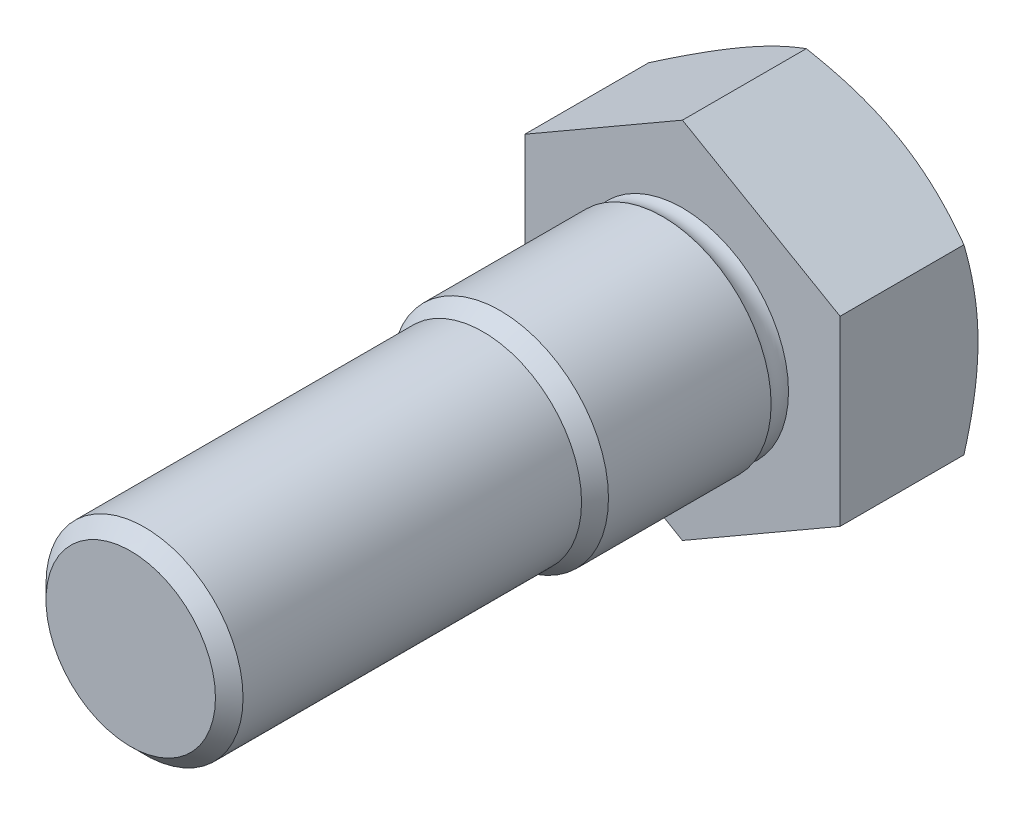
ISO-10303-21;
HEADER;
FILE_DESCRIPTION(('STEP AP214'),'2;1');
FILE_NAME('part.step','',(''),(''),'','','');
FILE_SCHEMA(('AUTOMOTIVE_DESIGN { 1 0 10303 214 1 1 1 1 }'));
ENDSEC;
DATA;
#1=APPLICATION_CONTEXT('core data for automotive mechanical design processes');
#2=APPLICATION_PROTOCOL_DEFINITION('international standard','automotive_design',2000,#1);
#3=PRODUCT_CONTEXT('',#1,'mechanical');
#4=PRODUCT('Part','Part','',(#3));
#5=PRODUCT_RELATED_PRODUCT_CATEGORY('part','',(#4));
#6=PRODUCT_DEFINITION_FORMATION('','',#4);
#7=PRODUCT_DEFINITION_CONTEXT('part definition',#1,'design');
#8=PRODUCT_DEFINITION('design','',#6,#7);
#9=PRODUCT_DEFINITION_SHAPE('','',#8);
#10=(LENGTH_UNIT() NAMED_UNIT(*) SI_UNIT(.MILLI.,.METRE.));
#11=(NAMED_UNIT(*) PLANE_ANGLE_UNIT() SI_UNIT($,.RADIAN.));
#12=(NAMED_UNIT(*) SI_UNIT($,.STERADIAN.) SOLID_ANGLE_UNIT());
#13=UNCERTAINTY_MEASURE_WITH_UNIT(LENGTH_MEASURE(1.E-05),#10,'distance_accuracy_value','');
#14=(GEOMETRIC_REPRESENTATION_CONTEXT(3) GLOBAL_UNCERTAINTY_ASSIGNED_CONTEXT((#13)) GLOBAL_UNIT_ASSIGNED_CONTEXT((#10,
#11,#12)) REPRESENTATION_CONTEXT('',''));
#15=CARTESIAN_POINT('',(0.,0.,0.));
#16=DIRECTION('',(0.,0.,1.));
#17=DIRECTION('',(1.,0.,0.));
#18=AXIS2_PLACEMENT_3D('',#15,#16,#17);
#19=CARTESIAN_POINT('',(0.,0.,32.676349186104));
#20=DIRECTION('',(0.,0.,-1.));
#21=DIRECTION('',(-1.,0.,0.));
#22=AXIS2_PLACEMENT_3D('',#19,#20,#21);
#23=CYLINDRICAL_SURFACE('',#22,5.5);
#24=CARTESIAN_POINT('',(0.,0.,8.));
#25=DIRECTION('',(0.,0.,1.));
#26=DIRECTION('',(1.,0.,0.));
#27=AXIS2_PLACEMENT_3D('',#24,#25,#26);
#28=CIRCLE('',#27,5.5);
#29=CARTESIAN_POINT('',(5.5,0.,8.));
#30=VERTEX_POINT('',#29);
#31=EDGE_CURVE('E264',#30,#30,#28,.T.);
#32=ORIENTED_EDGE('',*,*,#31,.T.);
#33=EDGE_LOOP('',(#32));
#34=FACE_BOUND('',#33,.T.);
#35=CARTESIAN_POINT('',(0.,0.,16.2539745962156));
#36=DIRECTION('',(0.,0.,1.));
#37=DIRECTION('',(1.,0.,0.));
#38=AXIS2_PLACEMENT_3D('',#35,#36,#37);
#39=CIRCLE('',#38,5.5);
#40=CARTESIAN_POINT('',(5.5,0.,16.2539745962156));
#41=VERTEX_POINT('',#40);
#42=EDGE_CURVE('E268',#41,#41,#39,.T.);
#43=ORIENTED_EDGE('',*,*,#42,.F.);
#44=EDGE_LOOP('',(#43));
#45=FACE_BOUND('',#44,.T.);
#46=ADVANCED_FACE('F31',(#34,#45),#23,.T.);
#47=CARTESIAN_POINT('',(0.,0.,17.12));
#48=DIRECTION('',(0.,0.,-1.));
#49=DIRECTION('',(-1.,0.,0.));
#50=AXIS2_PLACEMENT_3D('',#47,#48,#49);
#51=CONICAL_SURFACE('',#50,5.,0.523598775598293);
#52=ORIENTED_EDGE('',*,*,#42,.T.);
#53=EDGE_LOOP('',(#52));
#54=FACE_BOUND('',#53,.T.);
#55=CARTESIAN_POINT('',(0.,0.,17.12));
#56=DIRECTION('',(0.,0.,1.));
#57=DIRECTION('',(1.,0.,0.));
#58=AXIS2_PLACEMENT_3D('',#55,#56,#57);
#59=CIRCLE('',#58,5.);
#60=CARTESIAN_POINT('',(5.,0.,17.12));
#61=VERTEX_POINT('',#60);
#62=EDGE_CURVE('E265',#61,#61,#59,.T.);
#63=ORIENTED_EDGE('',*,*,#62,.F.);
#64=EDGE_LOOP('',(#63));
#65=FACE_BOUND('',#64,.T.);
#66=ADVANCED_FACE('F236',(#54,#65),#51,.T.);
#67=CARTESIAN_POINT('',(0.,0.,35.));
#68=DIRECTION('',(0.,0.,1.));
#69=DIRECTION('',(1.,0.,0.));
#70=AXIS2_PLACEMENT_3D('',#67,#68,#69);
#71=PLANE('',#70);
#72=CARTESIAN_POINT('',(0.,0.,35.));
#73=DIRECTION('',(0.,0.,1.));
#74=DIRECTION('',(1.,0.,0.));
#75=AXIS2_PLACEMENT_3D('',#72,#73,#74);
#76=CIRCLE('',#75,4.30000000000001);
#77=CARTESIAN_POINT('',(4.30000000000001,0.,35.));
#78=VERTEX_POINT('',#77);
#79=EDGE_CURVE('E133',#78,#78,#76,.T.);
#80=ORIENTED_EDGE('',*,*,#79,.T.);
#81=EDGE_LOOP('',(#80));
#82=FACE_BOUND('',#81,.T.);
#83=ADVANCED_FACE('F231',(#82),#71,.T.);
#84=CARTESIAN_POINT('',(0.,0.,35.));
#85=DIRECTION('',(0.,0.,-1.));
#86=DIRECTION('',(-1.,0.,0.));
#87=AXIS2_PLACEMENT_3D('',#84,#85,#86);
#88=CONICAL_SURFACE('',#87,4.30000000000001,0.785398163397448);
#89=CARTESIAN_POINT('',(0.,0.,34.3));
#90=DIRECTION('',(0.,0.,1.));
#91=DIRECTION('',(1.,0.,0.));
#92=AXIS2_PLACEMENT_3D('',#89,#90,#91);
#93=CIRCLE('',#92,5.);
#94=CARTESIAN_POINT('',(5.,0.,34.3));
#95=VERTEX_POINT('',#94);
#96=EDGE_CURVE('E40',#95,#95,#93,.F.);
#97=ORIENTED_EDGE('',*,*,#96,.F.);
#98=EDGE_LOOP('',(#97));
#99=FACE_BOUND('',#98,.T.);
#100=ORIENTED_EDGE('',*,*,#79,.F.);
#101=EDGE_LOOP('',(#100));
#102=FACE_BOUND('',#101,.T.);
#103=ADVANCED_FACE('F228',(#99,#102),#88,.T.);
#104=CARTESIAN_POINT('',(0.,0.,35.));
#105=DIRECTION('',(0.,0.,-1.));
#106=DIRECTION('',(-1.,0.,0.));
#107=AXIS2_PLACEMENT_3D('',#104,#105,#106);
#108=CYLINDRICAL_SURFACE('',#107,5.);
#109=ORIENTED_EDGE('',*,*,#62,.T.);
#110=EDGE_LOOP('',(#109));
#111=FACE_BOUND('',#110,.T.);
#112=ORIENTED_EDGE('',*,*,#96,.T.);
#113=EDGE_LOOP('',(#112));
#114=FACE_BOUND('',#113,.T.);
#115=ADVANCED_FACE('F226',(#111,#114),#108,.T.);
#116=CARTESIAN_POINT('',(8.,-4.61880215351701,0.));
#117=DIRECTION('',(0.,0.,1.));
#118=DIRECTION('',(1.,0.,0.));
#119=AXIS2_PLACEMENT_3D('',#116,#117,#118);
#120=PLANE('',#119);
#121=CARTESIAN_POINT('',(0.,0.,0.));
#122=DIRECTION('',(0.,0.,1.));
#123=DIRECTION('',(1.,0.,0.));
#124=AXIS2_PLACEMENT_3D('',#121,#122,#123);
#125=CIRCLE('',#124,7.99999999999999);
#126=CARTESIAN_POINT('',(8.,0.,0.));
#127=VERTEX_POINT('',#126);
#128=CARTESIAN_POINT('',(4.00000000000001,6.92820323027551,0.));
#129=VERTEX_POINT('',#128);
#130=EDGE_CURVE('E107',#127,#129,#125,.T.);
#131=ORIENTED_EDGE('',*,*,#130,.F.);
#132=CARTESIAN_POINT('',(4.00000000000001,-6.92820323027551,0.));
#133=VERTEX_POINT('',#132);
#134=EDGE_CURVE('E121',#133,#127,#125,.T.);
#135=ORIENTED_EDGE('',*,*,#134,.F.);
#136=CARTESIAN_POINT('',(-3.99999999999999,-6.92820323027551,0.));
#137=VERTEX_POINT('',#136);
#138=EDGE_CURVE('E127',#137,#133,#125,.T.);
#139=ORIENTED_EDGE('',*,*,#138,.F.);
#140=CARTESIAN_POINT('',(-8.00000000000001,0.,0.));
#141=VERTEX_POINT('',#140);
#142=EDGE_CURVE('E282',#141,#137,#125,.T.);
#143=ORIENTED_EDGE('',*,*,#142,.F.);
#144=CARTESIAN_POINT('',(0.,0.,0.));
#145=DIRECTION('',(0.,0.,-1.));
#146=DIRECTION('',(-1.,0.,0.));
#147=AXIS2_PLACEMENT_3D('',#144,#145,#146);
#148=CIRCLE('',#147,8.);
#149=CARTESIAN_POINT('',(-3.99999999999999,6.92820323027552,0.));
#150=VERTEX_POINT('',#149);
#151=EDGE_CURVE('E198',#141,#150,#148,.T.);
#152=ORIENTED_EDGE('',*,*,#151,.T.);
#153=EDGE_CURVE('E132',#129,#150,#125,.T.);
#154=ORIENTED_EDGE('',*,*,#153,.F.);
#155=EDGE_LOOP('',(#131,#135,#139,#143,#152,#154));
#156=FACE_BOUND('',#155,.T.);
#157=ADVANCED_FACE('F130',(#156),#120,.F.);
#158=CARTESIAN_POINT('',(0.,0.,0.));
#159=DIRECTION('',(0.,0.,1.));
#160=DIRECTION('',(1.,0.,0.));
#161=AXIS2_PLACEMENT_3D('',#158,#159,#160);
#162=CONICAL_SURFACE('',#161,8.,1.0471975511966);
#163=CARTESIAN_POINT('',(-8.,-12.6403241833434,4.01789851784305));
#164=CARTESIAN_POINT('',(-8.,-12.2888429890866,3.84647214639295));
#165=CARTESIAN_POINT('',(-8.,-11.9365795347971,3.67662339343778));
#166=CARTESIAN_POINT('',(-8.,-11.2300728594024,3.34096411570282));
#167=CARTESIAN_POINT('',(-8.,-10.8758293564386,3.17515418482525));
#168=CARTESIAN_POINT('',(-8.,-10.1632322009988,2.84767085157217));
#169=CARTESIAN_POINT('',(-8.,-9.80486679345536,2.6860229433273));
#170=CARTESIAN_POINT('',(-8.,-9.08536584086789,2.36903857257057));
#171=CARTESIAN_POINT('',(-8.,-8.724230421138,2.2137018265232));
#172=CARTESIAN_POINT('',(-8.,-7.98618086757373,1.9058114273111));
#173=CARTESIAN_POINT('',(-8.,-7.60915018490751,1.75353567068399));
#174=CARTESIAN_POINT('',(-8.,-6.85076602340426,1.45995337106733));
#175=CARTESIAN_POINT('',(-8.,-6.46941207785118,1.31864802555921));
#176=CARTESIAN_POINT('',(-8.,-5.70241101632928,1.05054563337358));
#177=CARTESIAN_POINT('',(-8.,-5.31677359268765,0.923721145933576));
#178=CARTESIAN_POINT('',(-8.,-4.53998543836163,0.688493264105613));
#179=CARTESIAN_POINT('',(-8.,-4.14883641023642,0.58008431055247));
#180=CARTESIAN_POINT('',(-8.,-3.36291309371654,0.387316247498429));
#181=CARTESIAN_POINT('',(-8.,-2.96817310524605,0.302820974454293));
#182=CARTESIAN_POINT('',(-8.,-2.3722892993417,0.197556855991643));
#183=CARTESIAN_POINT('',(-8.,-2.1730197130932,0.166047305895429));
#184=CARTESIAN_POINT('',(-8.,-1.77341268345331,0.1107993023029));
#185=CARTESIAN_POINT('',(-8.,-1.57307534588495,0.0870600927388169));
#186=CARTESIAN_POINT('',(-8.,-1.17432003024232,0.0481362144368652));
#187=CARTESIAN_POINT('',(-8.,-0.975913034515718,0.0328395247829208));
#188=CARTESIAN_POINT('',(-8.,-0.578629157865872,0.010658858196026));
#189=CARTESIAN_POINT('',(-8.,-0.379752285177633,0.00377473490532678));
#190=CARTESIAN_POINT('',(-8.,0.0181162150089513,-0.0014154661245643));
#191=CARTESIAN_POINT('',(-8.,0.217107843016772,0.000278494517865791));
#192=CARTESIAN_POINT('',(-8.,0.614837468786354,0.0122006755463315));
#193=CARTESIAN_POINT('',(-8.,0.81357545480147,0.0224292777804836));
#194=CARTESIAN_POINT('',(-8.,1.28422958627987,0.0565371950239333));
#195=CARTESIAN_POINT('',(-8.,1.55588666308064,0.0840774147758934));
#196=CARTESIAN_POINT('',(-8.,2.09732304369346,0.153653648455684));
#197=CARTESIAN_POINT('',(-8.,2.36710211351336,0.195691436873356));
#198=CARTESIAN_POINT('',(-8.,3.17322846736411,0.341333232790534));
#199=CARTESIAN_POINT('',(-8.,3.70610588911144,0.464444296799975));
#200=CARTESIAN_POINT('',(-8.,4.50338682227296,0.679733886019482));
#201=CARTESIAN_POINT('',(-8.,4.77187300826741,0.757678325488099));
#202=CARTESIAN_POINT('',(-8.,5.30624231268929,0.922110347210544));
#203=CARTESIAN_POINT('',(-8.,5.57212541058544,1.00859799678746));
#204=CARTESIAN_POINT('',(-8.,6.10136687832057,1.18869198559409));
#205=CARTESIAN_POINT('',(-8.,6.36472591087366,1.28229639520745));
#206=CARTESIAN_POINT('',(-8.,6.88922945996469,1.47547803240337));
#207=CARTESIAN_POINT('',(-8.,7.15037403059555,1.57505511360829));
#208=CARTESIAN_POINT('',(-8.,7.86355536188811,1.85485522871918));
#209=CARTESIAN_POINT('',(-8.,8.313603084598,2.04014375249856));
#210=CARTESIAN_POINT('',(-8.,9.20895545948566,2.42188767730524));
#211=CARTESIAN_POINT('',(-8.,9.65425954009886,2.61834440632378));
#212=CARTESIAN_POINT('',(-8.,10.541236340582,3.01973674859059));
#213=CARTESIAN_POINT('',(-8.,10.9829074987088,3.22467580105594));
#214=CARTESIAN_POINT('',(-8.,11.8631821273786,3.64096812735071));
#215=CARTESIAN_POINT('',(-8.,12.3017857316924,3.85232111930627));
#216=CARTESIAN_POINT('',(-8.,13.177281429533,4.28038318141343));
#217=CARTESIAN_POINT('',(-8.,13.6141693975596,4.49710067110502));
#218=CARTESIAN_POINT('',(-8.,14.4859595755013,4.93449647151289));
#219=CARTESIAN_POINT('',(-8.,14.9208617674875,5.15517481790222));
#220=CARTESIAN_POINT('',(-8.,15.7889376444029,5.59965094163212));
#221=CARTESIAN_POINT('',(-8.,16.2221117130533,5.82344797046282));
#222=CARTESIAN_POINT('',(-8.,17.0871185676234,6.27362076813179));
#223=CARTESIAN_POINT('',(-8.,17.5189513481033,6.49999654741127));
#224=CARTESIAN_POINT('',(-8.,18.7191295779796,7.13289881626216));
#225=CARTESIAN_POINT('',(-8.,19.4862640194244,7.54172124153189));
#226=CARTESIAN_POINT('',(-8.,21.0179839380858,8.36422301189388));
#227=CARTESIAN_POINT('',(-8.,21.7825692437129,8.77790267579173));
#228=CARTESIAN_POINT('',(-8.,23.3071112200699,9.60742602218));
#229=CARTESIAN_POINT('',(-8.,24.0670747349003,10.0232571342856));
#230=CARTESIAN_POINT('',(-8.,25.2058550741706,10.6490470989963));
#231=CARTESIAN_POINT('',(-8.,25.5852388074708,10.8579756805346));
#232=CARTESIAN_POINT('',(-8.,26.3436690578958,11.2764429633006));
#233=CARTESIAN_POINT('',(-8.,26.7227155754333,11.4859816637799));
#234=CARTESIAN_POINT('',(-8.,27.1016142702961,11.6957873913853));
#235=B_SPLINE_CURVE_WITH_KNOTS('',3,(#163,#164,#165,#166,#167,#168,#169,#170,#171,#172,#173,
#174,#175,#176,#177,#178,#179,#180,#181,#182,#183,#184,#185,#186,#187,#188,#189,#190,#191,#192,
#193,#194,#195,#196,#197,#198,#199,#200,#201,#202,#203,#204,#205,#206,#207,#208,#209,#210,#211,
#212,#213,#214,#215,#216,#217,#218,#219,#220,#221,#222,#223,#224,#225,#226,#227,#228,#229,#230,
#231,#232,#233,#234),.UNSPECIFIED.,.F.,.F.,(4,2,2,2,2,2,2,2,2,2,2,2,2,2,2,2,2,2,2,2,2,2,2,2,2,2,
2,2,2,2,2,2,2,2,2,4),(0.,1.1731859787337,2.34654344362964,3.52590216218919,4.7052078381092,
5.92493599017794,7.1447970957138,8.36230683142862,9.57944837731922,10.7895133418803,
11.3946221179473,11.999671998354,12.5964878477067,13.193293313799,13.7901014502291,
14.3869362898641,15.2056272335913,16.0244184199664,17.6627769162718,18.5014144517381,
19.3400585964502,20.1784761591639,21.0168731824131,22.4767387549655,23.9367782820917,
25.3974157055603,26.8579890309847,28.3210217326113,29.784067617513,31.2467682084832,
32.7094747239385,35.317258670726,37.9252147473841,40.5240797476638,41.8234055238151,
43.122729706963),.UNSPECIFIED.);
#236=CARTESIAN_POINT('',(-8.,-4.618802153517,0.714531179816331));
#237=VERTEX_POINT('',#236);
#238=EDGE_CURVE('E178',#237,#141,#235,.T.);
#239=ORIENTED_EDGE('',*,*,#238,.T.);
#240=ORIENTED_EDGE('',*,*,#142,.T.);
#241=CARTESIAN_POINT('',(0.00019999999999742,-9.23771977708785,0.714597847732976));
#242=CARTESIAN_POINT('',(-0.175648783879898,-9.13619343437812,0.6559907140473));
#243=CARTESIAN_POINT('',(-0.352153194306136,-9.03428856550538,0.600043401047293));
#244=CARTESIAN_POINT('',(-0.70659546287846,-8.82965122633296,0.49420100502467));
#245=CARTESIAN_POINT('',(-0.884533904692713,-8.72691841905232,0.444308534431071));
#246=CARTESIAN_POINT('',(-1.42119823762264,-8.41707512197076,0.304692797206871));
#247=CARTESIAN_POINT('',(-1.78204258223572,-8.20874154247284,0.225281170978373));
#248=CARTESIAN_POINT('',(-2.32203917020405,-7.89697436704785,0.132161646294494));
#249=CARTESIAN_POINT('',(-2.49957818964329,-7.79447216638294,0.10563458102913));
#250=CARTESIAN_POINT('',(-2.8554591129602,-7.58900421950647,0.061153174858883));
#251=CARTESIAN_POINT('',(-3.03380094449324,-7.4860385150631,0.0431980765145882));
#252=CARTESIAN_POINT('',(-3.3907916848236,-7.27992981503516,0.0163156484918735));
#253=CARTESIAN_POINT('',(-3.5694400136095,-7.17678715432034,0.00737807354624106));
#254=CARTESIAN_POINT('',(-3.92690170509738,-6.97040655051484,-0.00127769603486301));
#255=CARTESIAN_POINT('',(-4.10571506253007,-6.86716861046638,-0.000996175497143248));
#256=CARTESIAN_POINT('',(-4.44001336701691,-6.67416139438126,0.00814502526878315));
#257=CARTESIAN_POINT('',(-4.59552190433867,-6.58437849849726,0.0158896043673779));
#258=CARTESIAN_POINT('',(-4.90617476174051,-6.40502298765178,0.0382011348534369));
#259=CARTESIAN_POINT('',(-5.06131905656,-6.31545038727451,0.0527685461381558));
#260=CARTESIAN_POINT('',(-5.52615131589482,-6.04707935721953,0.106360690527544));
#261=CARTESIAN_POINT('',(-5.83501648718172,-5.86875596743374,0.155268641669151));
#262=CARTESIAN_POINT('',(-6.4560232287603,-5.51021755801477,0.277539403234321));
#263=CARTESIAN_POINT('',(-6.76808554211448,-5.3300482973958,0.351420520376007));
#264=CARTESIAN_POINT('',(-7.38755648169476,-4.97239658367397,0.519100141254979));
#265=CARTESIAN_POINT('',(-7.69497304089175,-4.79490955046824,0.612859260854462));
#266=CARTESIAN_POINT('',(-8.0002,-4.61868668346316,0.714597847732981));
#267=B_SPLINE_CURVE_WITH_KNOTS('',3,(#241,#242,#243,#244,#245,#246,#247,#248,#249,#250,#251,
#252,#253,#254,#255,#256,#257,#258,#259,#260,#261,#262,#263,#264,#265,#266),.UNSPECIFIED.,.F.,
.F.,(4,2,2,2,2,2,2,2,2,2,2,2,4),(0.,0.633973543721348,1.26821965714356,2.53934712434765,
3.15934343977049,3.77928496069784,4.39852133866765,5.01773858515595,5.55680239410248,
6.09590254421147,7.17487077411834,8.27776850154292,9.37850115249054),.UNSPECIFIED.);
#268=EDGE_CURVE('E185',#137,#237,#267,.T.);
#269=ORIENTED_EDGE('',*,*,#268,.T.);
#270=EDGE_LOOP('',(#239,#240,#269));
#271=FACE_BOUND('',#270,.T.);
#272=ADVANCED_FACE('F281',(#271),#162,.T.);
#273=CARTESIAN_POINT('',(-8.0002,4.61868668346317,0.714597847732984));
#274=CARTESIAN_POINT('',(-7.8243512161201,4.7202130261729,0.655990714047309));
#275=CARTESIAN_POINT('',(-7.64784680569387,4.82211789504564,0.600043401047301));
#276=CARTESIAN_POINT('',(-7.29340453712154,5.02675523421806,0.494201005024678));
#277=CARTESIAN_POINT('',(-7.11546609530729,5.1294880414987,0.444308534431078));
#278=CARTESIAN_POINT('',(-6.57880176237736,5.43933133858026,0.304692797206878));
#279=CARTESIAN_POINT('',(-6.21795741776428,5.64766491807818,0.225281170978379));
#280=CARTESIAN_POINT('',(-5.67796082979595,5.95943209350317,0.132161646294499));
#281=CARTESIAN_POINT('',(-5.50042181035672,6.06193429416807,0.105634581029135));
#282=CARTESIAN_POINT('',(-5.1445408870398,6.26740224104455,0.0611531748588862));
#283=CARTESIAN_POINT('',(-4.96619905550676,6.37036794548792,0.0431980765145903));
#284=CARTESIAN_POINT('',(-4.60920831517641,6.57647664551585,0.0163156484918749));
#285=CARTESIAN_POINT('',(-4.4305599863905,6.67961930623067,0.00737807354624275));
#286=CARTESIAN_POINT('',(-4.07309829490262,6.88599991003618,-0.0012776960348606));
#287=CARTESIAN_POINT('',(-3.89428493746994,6.98923785008464,-0.00099617549714044));
#288=CARTESIAN_POINT('',(-3.5599866329831,7.18224506616975,0.00814502526878492));
#289=CARTESIAN_POINT('',(-3.40447809566133,7.27202796205376,0.0158896043673785));
#290=CARTESIAN_POINT('',(-3.09382523825949,7.45138347289924,0.0382011348534363));
#291=CARTESIAN_POINT('',(-2.93868094344,7.5409560732765,0.0527685461381553));
#292=CARTESIAN_POINT('',(-2.47384868410518,7.80932710333148,0.106360690527543));
#293=CARTESIAN_POINT('',(-2.16498351281828,7.98765049311728,0.15526864166915));
#294=CARTESIAN_POINT('',(-1.5439767712397,8.34618890253624,0.277539403234318));
#295=CARTESIAN_POINT('',(-1.23191445788552,8.52635816315521,0.351420520376003));
#296=CARTESIAN_POINT('',(-0.612443518305241,8.88400987687704,0.519100141254973));
#297=CARTESIAN_POINT('',(-0.305026959108248,9.06149691008277,0.612859260854456));
#298=CARTESIAN_POINT('',(0.000200000000001025,9.23771977708785,0.714597847732976));
#299=B_SPLINE_CURVE_WITH_KNOTS('',3,(#273,#274,#275,#276,#277,#278,#279,#280,#281,#282,#283,
#284,#285,#286,#287,#288,#289,#290,#291,#292,#293,#294,#295,#296,#297,#298),.UNSPECIFIED.,.F.,
.F.,(4,2,2,2,2,2,2,2,2,2,2,2,4),(0.,0.633973543721351,1.26821965714356,2.53934712434766,
3.15934343977049,3.77928496069783,4.39852133866765,5.01773858515595,5.55680239410248,
6.09590254421147,7.17487077411834,8.27776850154292,9.37850115249054),.UNSPECIFIED.);
#300=CARTESIAN_POINT('',(-8.,4.61880215351701,0.714531179816333));
#301=VERTEX_POINT('',#300);
#302=EDGE_CURVE('E55',#301,#150,#299,.T.);
#303=ORIENTED_EDGE('',*,*,#302,.T.);
#304=ORIENTED_EDGE('',*,*,#151,.F.);
#305=EDGE_CURVE('E137',#141,#301,#235,.T.);
#306=ORIENTED_EDGE('',*,*,#305,.T.);
#307=EDGE_LOOP('',(#303,#304,#306));
#308=FACE_BOUND('',#307,.T.);
#309=ADVANCED_FACE('F197',(#308),#162,.T.);
#310=CARTESIAN_POINT('',(-0.000199999999998213,9.23771977708785,0.714597847732978));
#311=CARTESIAN_POINT('',(0.175648783879898,9.13619343437813,0.655990714047302));
#312=CARTESIAN_POINT('',(0.352153194306136,9.03428856550538,0.600043401047295));
#313=CARTESIAN_POINT('',(0.70659546287846,8.82965122633297,0.494201005024671));
#314=CARTESIAN_POINT('',(0.884533904692712,8.72691841905232,0.444308534431072));
#315=CARTESIAN_POINT('',(1.42119823762264,8.41707512197076,0.304692797206871));
#316=CARTESIAN_POINT('',(1.78204258223572,8.20874154247284,0.225281170978373));
#317=CARTESIAN_POINT('',(2.32203917020405,7.89697436704785,0.132161646294494));
#318=CARTESIAN_POINT('',(2.49957818964329,7.79447216638294,0.10563458102913));
#319=CARTESIAN_POINT('',(2.8554591129602,7.58900421950647,0.0611531748588811));
#320=CARTESIAN_POINT('',(3.03380094449324,7.4860385150631,0.0431980765145845));
#321=CARTESIAN_POINT('',(3.39079168482359,7.27992981503517,0.0163156484918691));
#322=CARTESIAN_POINT('',(3.5694400136095,7.17678715432034,0.0073780735462377));
#323=CARTESIAN_POINT('',(3.92690170509738,6.97040655051484,-0.00127769603486563));
#324=CARTESIAN_POINT('',(4.10571506253007,6.86716861046638,-0.000996175497146228));
#325=CARTESIAN_POINT('',(4.4400133670169,6.67416139438127,0.00814502526877934));
#326=CARTESIAN_POINT('',(4.59552190433867,6.58437849849726,0.0158896043673736));
#327=CARTESIAN_POINT('',(4.90617476174051,6.40502298765178,0.0382011348534315));
#328=CARTESIAN_POINT('',(5.06131905656,6.31545038727451,0.0527685461381498));
#329=CARTESIAN_POINT('',(5.52615131589482,6.04707935721954,0.106360690527536));
#330=CARTESIAN_POINT('',(5.83501648718172,5.86875596743374,0.155268641669144));
#331=CARTESIAN_POINT('',(6.4560232287603,5.51021755801478,0.277539403234312));
#332=CARTESIAN_POINT('',(6.76808554211448,5.33004829739581,0.351420520375997));
#333=CARTESIAN_POINT('',(7.38755648169476,4.97239658367398,0.519100141254967));
#334=CARTESIAN_POINT('',(7.69497304089175,4.79490955046825,0.612859260854449));
#335=CARTESIAN_POINT('',(8.0002,4.61868668346317,0.714597847732969));
#336=B_SPLINE_CURVE_WITH_KNOTS('',3,(#310,#311,#312,#313,#314,#315,#316,#317,#318,#319,#320,
#321,#322,#323,#324,#325,#326,#327,#328,#329,#330,#331,#332,#333,#334,#335),.UNSPECIFIED.,.F.,
.F.,(4,2,2,2,2,2,2,2,2,2,2,2,4),(0.,0.633973543721349,1.26821965714356,2.53934712434766,
3.15934343977049,3.77928496069784,4.39852133866766,5.01773858515595,5.55680239410248,
6.09590254421147,7.17487077411834,8.27776850154292,9.37850115249054),.UNSPECIFIED.);
#337=CARTESIAN_POINT('',(0.,9.23760430703401,0.714531179816326));
#338=VERTEX_POINT('',#337);
#339=EDGE_CURVE('E47',#338,#129,#336,.T.);
#340=ORIENTED_EDGE('',*,*,#339,.T.);
#341=ORIENTED_EDGE('',*,*,#153,.T.);
#342=EDGE_CURVE('E115',#150,#338,#299,.T.);
#343=ORIENTED_EDGE('',*,*,#342,.T.);
#344=EDGE_LOOP('',(#340,#341,#343));
#345=FACE_BOUND('',#344,.T.);
#346=ADVANCED_FACE('F154',(#345),#162,.T.);
#347=CARTESIAN_POINT('',(8.,4.61880215351701,0.714531179816319));
#348=VERTEX_POINT('',#347);
#349=EDGE_CURVE('E110',#129,#348,#336,.T.);
#350=ORIENTED_EDGE('',*,*,#349,.T.);
#351=CARTESIAN_POINT('',(8.,-12.6403241960332,4.0178985240338));
#352=CARTESIAN_POINT('',(8.,-12.288843001349,3.84647215232604));
#353=CARTESIAN_POINT('',(8.,-11.9365795466317,3.67662339911334));
#354=CARTESIAN_POINT('',(8.,-11.2300728703803,3.34096412086458));
#355=CARTESIAN_POINT('',(8.,-10.8758293669874,3.17515418973072));
#356=CARTESIAN_POINT('',(8.,-10.1632322106833,2.847670855965));
#357=CARTESIAN_POINT('',(8.,-9.80486680270439,2.68602294746378));
#358=CARTESIAN_POINT('',(8.,-9.08536584924318,2.36903857619859));
#359=CARTESIAN_POINT('',(8.,-8.72423042907499,2.21370182989907));
#360=CARTESIAN_POINT('',(8.,-7.98618087459866,1.90581143017456));
#361=CARTESIAN_POINT('',(8.,-7.60915019145841,1.75353567328779));
#362=CARTESIAN_POINT('',(8.,-6.85076602899958,1.45995337316545));
#363=CARTESIAN_POINT('',(8.,-6.46941208296495,1.31864802741133));
#364=CARTESIAN_POINT('',(8.,-5.70241102047107,1.05054563475681));
#365=CARTESIAN_POINT('',(8.,-5.31677359633905,0.923721147093869));
#366=CARTESIAN_POINT('',(8.,-4.53998544101906,0.688493264855756));
#367=CARTESIAN_POINT('',(8.,-4.14883641239029,0.580084311115384));
#368=CARTESIAN_POINT('',(8.,-3.36291309460871,0.387316247682894));
#369=CARTESIAN_POINT('',(8.,-2.96817310537658,0.302820974461516));
#370=CARTESIAN_POINT('',(8.,-2.37228929831599,0.197556855818358));
#371=CARTESIAN_POINT('',(8.,-2.17301971167991,0.166047305676217));
#372=CARTESIAN_POINT('',(8.,-1.77341268126145,0.110799302023636));
#373=CARTESIAN_POINT('',(8.,-1.57307534330208,0.0870600924454204));
#374=CARTESIAN_POINT('',(8.,-1.1743200268856,0.0481362141498915));
#375=CARTESIAN_POINT('',(8.,-0.975913030776185,0.0328395245158564));
#376=CARTESIAN_POINT('',(8.,-0.578629153361273,0.0106588580027819));
#377=CARTESIAN_POINT('',(8.,-0.379752280290782,0.00377473476599314));
#378=CARTESIAN_POINT('',(8.,0.0181162206575787,-0.00141546612270079));
#379=CARTESIAN_POINT('',(8.,0.217107849044924,0.000278494607021058));
#380=CARTESIAN_POINT('',(8.,0.614837475568708,0.0122006758412064));
#381=CARTESIAN_POINT('',(8.,0.813575461958501,0.0224292781937895));
#382=CARTESIAN_POINT('',(8.,1.28422959400839,0.0565371957283214));
#383=CARTESIAN_POINT('',(8.,1.55588667100439,0.0840774156472938));
#384=CARTESIAN_POINT('',(8.,2.0973230519986,0.153653649669938));
#385=CARTESIAN_POINT('',(8.,2.36710212200467,0.195691438263453));
#386=CARTESIAN_POINT('',(8.,3.1732284764035,0.341333234711692));
#387=CARTESIAN_POINT('',(8.,3.70610589850139,0.464444299079657));
#388=CARTESIAN_POINT('',(8.,4.50338683218715,0.679733888827771));
#389=CARTESIAN_POINT('',(8.,4.77187301836023,0.757678328473787));
#390=CARTESIAN_POINT('',(8.,5.30624232313727,0.922110350545404));
#391=CARTESIAN_POINT('',(8.,5.57212542120996,1.0085980002941));
#392=CARTESIAN_POINT('',(8.,6.10136688929674,1.1886919894379));
#393=CARTESIAN_POINT('',(8.,6.36472592202498,1.28229639921665));
#394=CARTESIAN_POINT('',(8.,6.8892294714663,1.47547803673738));
#395=CARTESIAN_POINT('',(8.,7.15037404227232,1.57505511810173));
#396=CARTESIAN_POINT('',(8.,7.86355537366013,1.85485523349089));
#397=CARTESIAN_POINT('',(8.,8.31360309629564,2.04014375737068));
#398=CARTESIAN_POINT('',(8.,9.20895547104425,2.42188768234841));
#399=CARTESIAN_POINT('',(8.,9.65425955159279,2.61834441143759));
#400=CARTESIAN_POINT('',(8.,10.5412363519535,3.01973675382426));
#401=CARTESIAN_POINT('',(8.,10.9829075100225,3.2246758063388));
#402=CARTESIAN_POINT('',(8.,11.8631821385832,3.64096813271695));
#403=CARTESIAN_POINT('',(8.,12.3017857428456,3.85232112470669));
#404=CARTESIAN_POINT('',(8.,13.1772814405846,4.28038318686974));
#405=CARTESIAN_POINT('',(8.,13.6141694085612,4.49710067658296));
#406=CARTESIAN_POINT('',(8.,14.4859595864064,4.93449647702592));
#407=CARTESIAN_POINT('',(8.,14.9208617783462,5.15517482342872));
#408=CARTESIAN_POINT('',(8.,15.7889376551724,5.59965094717974));
#409=CARTESIAN_POINT('',(8.,16.2221117237798,5.82344797601809));
#410=CARTESIAN_POINT('',(8.,17.0871185782664,6.27362077369771));
#411=CARTESIAN_POINT('',(8.,17.5189513587056,6.49999655298018));
#412=CARTESIAN_POINT('',(8.,18.7191295885401,7.1328988218707));
#413=CARTESIAN_POINT('',(7.99999999999999,19.4862640299852,7.54172124717379));
#414=CARTESIAN_POINT('',(7.99999999999999,21.0179839486505,8.36422301759573));
#415=CARTESIAN_POINT('',(7.99999999999999,21.782569254281,8.77790268152017));
#416=CARTESIAN_POINT('',(7.99999999999999,23.3071112306593,9.6074260279635));
#417=CARTESIAN_POINT('',(7.99999999999999,24.0670747455074,10.0232571400977));
#418=CARTESIAN_POINT('',(7.99999999999999,25.2058550848056,10.6490471048489));
#419=CARTESIAN_POINT('',(7.99999999999999,25.5852388181154,10.8579756864004));
#420=CARTESIAN_POINT('',(7.99999999999999,26.34366906856,11.276442969192));
#421=CARTESIAN_POINT('',(7.99999999999999,26.7227155861075,11.4859816696838));
#422=CARTESIAN_POINT('',(7.99999999999999,27.1016142809804,11.6957873973015));
#423=B_SPLINE_CURVE_WITH_KNOTS('',3,(#351,#352,#353,#354,#355,#356,#357,#358,#359,#360,#361,
#362,#363,#364,#365,#366,#367,#368,#369,#370,#371,#372,#373,#374,#375,#376,#377,#378,#379,#380,
#381,#382,#383,#384,#385,#386,#387,#388,#389,#390,#391,#392,#393,#394,#395,#396,#397,#398,#399,
#400,#401,#402,#403,#404,#405,#406,#407,#408,#409,#410,#411,#412,#413,#414,#415,#416,#417,#418,
#419,#420,#421,#422),.UNSPECIFIED.,.F.,.F.,(4,2,2,2,2,2,2,2,2,2,2,2,2,2,2,2,2,2,2,2,2,2,2,2,2,2,
2,2,2,2,2,2,2,2,2,4),(0.,1.17318598022512,2.34654344661269,3.52590216667916,4.70520784410597,
5.92493599778492,7.14479710493153,8.36230684225201,9.57944838974701,10.789513356648,
11.3946221338842,11.9996720154598,12.5964878659519,13.1932933331835,13.7901014707533,
14.3869363115282,15.2056272558883,16.0244184428963,17.6627769404704,18.5014144766,
19.3400586219754,20.1784761853505,21.0168732092613,22.4767387817232,23.936778308758,
25.3974157321319,26.857989057462,28.3210217589829,29.7840676437789,31.2467682346453,
32.7094747499967,35.3172586968324,37.9252147735377,40.5240797739051,41.8234055501008,
43.122729733293),.UNSPECIFIED.);
#424=EDGE_CURVE('E103',#348,#127,#423,.F.);
#425=ORIENTED_EDGE('',*,*,#424,.T.);
#426=ORIENTED_EDGE('',*,*,#130,.T.);
#427=EDGE_LOOP('',(#350,#425,#426));
#428=FACE_BOUND('',#427,.T.);
#429=ADVANCED_FACE('F105',(#428),#162,.T.);
#430=CARTESIAN_POINT('',(8.0002,-4.61868668346317,0.714597847732971));
#431=CARTESIAN_POINT('',(7.8243512161201,-4.72021302617289,0.655990714047296));
#432=CARTESIAN_POINT('',(7.64784680569387,-4.82211789504564,0.600043401047289));
#433=CARTESIAN_POINT('',(7.29340453712154,-5.02675523421805,0.494201005024666));
#434=CARTESIAN_POINT('',(7.11546609530729,-5.12948804149869,0.444308534431066));
#435=CARTESIAN_POINT('',(6.57880176237736,-5.43933133858026,0.304692797206867));
#436=CARTESIAN_POINT('',(6.21795741776428,-5.64766491807818,0.22528117097837));
#437=CARTESIAN_POINT('',(5.67796082979595,-5.95943209350317,0.13216164629449));
#438=CARTESIAN_POINT('',(5.50042181035672,-6.06193429416807,0.105634581029126));
#439=CARTESIAN_POINT('',(5.1445408870398,-6.26740224104455,0.0611531748588777));
#440=CARTESIAN_POINT('',(4.96619905550676,-6.37036794548792,0.0431980765145823));
#441=CARTESIAN_POINT('',(4.6092083151764,-6.57647664551585,0.0163156484918672));
#442=CARTESIAN_POINT('',(4.4305599863905,-6.67961930623067,0.00737807354623493));
#443=CARTESIAN_POINT('',(4.07309829490261,-6.88599991003618,-0.00127769603486847));
#444=CARTESIAN_POINT('',(3.89428493746993,-6.98923785008464,-0.00099617549714825));
#445=CARTESIAN_POINT('',(3.55998663298309,-7.18224506616975,0.00814502526877805));
#446=CARTESIAN_POINT('',(3.40447809566133,-7.27202796205376,0.0158896043673724));
#447=CARTESIAN_POINT('',(3.09382523825949,-7.45138347289924,0.0382011348534311));
#448=CARTESIAN_POINT('',(2.93868094344,-7.5409560732765,0.0527685461381501));
#449=CARTESIAN_POINT('',(2.47384868410518,-7.80932710333148,0.106360690527538));
#450=CARTESIAN_POINT('',(2.16498351281828,-7.98765049311728,0.155268641669146));
#451=CARTESIAN_POINT('',(1.5439767712397,-8.34618890253624,0.277539403234315));
#452=CARTESIAN_POINT('',(1.23191445788552,-8.52635816315521,0.351420520376));
#453=CARTESIAN_POINT('',(0.612443518305239,-8.88400987687704,0.519100141254972));
#454=CARTESIAN_POINT('',(0.305026959108247,-9.06149691008277,0.612859260854455));
#455=CARTESIAN_POINT('',(-0.000200000000001604,-9.23771977708785,0.714597847732975));
#456=B_SPLINE_CURVE_WITH_KNOTS('',3,(#430,#431,#432,#433,#434,#435,#436,#437,#438,#439,#440,
#441,#442,#443,#444,#445,#446,#447,#448,#449,#450,#451,#452,#453,#454,#455),.UNSPECIFIED.,.F.,
.F.,(4,2,2,2,2,2,2,2,2,2,2,2,4),(0.,0.633973543721349,1.26821965714356,2.53934712434766,
3.15934343977049,3.77928496069784,4.39852133866766,5.01773858515595,5.55680239410249,
6.09590254421148,7.17487077411835,8.27776850154292,9.37850115249054),.UNSPECIFIED.);
#457=CARTESIAN_POINT('',(0.,-9.23760430703401,0.714531179816324));
#458=VERTEX_POINT('',#457);
#459=EDGE_CURVE('E183',#133,#458,#456,.T.);
#460=ORIENTED_EDGE('',*,*,#459,.T.);
#461=EDGE_CURVE('E184',#458,#137,#267,.T.);
#462=ORIENTED_EDGE('',*,*,#461,.T.);
#463=ORIENTED_EDGE('',*,*,#138,.T.);
#464=EDGE_LOOP('',(#460,#462,#463));
#465=FACE_BOUND('',#464,.T.);
#466=ADVANCED_FACE('F275',(#465),#162,.T.);
#467=CARTESIAN_POINT('',(8.,-4.61880215351701,0.714531179816319));
#468=VERTEX_POINT('',#467);
#469=EDGE_CURVE('E116',#127,#468,#423,.F.);
#470=ORIENTED_EDGE('',*,*,#469,.T.);
#471=EDGE_CURVE('E124',#468,#133,#456,.T.);
#472=ORIENTED_EDGE('',*,*,#471,.T.);
#473=ORIENTED_EDGE('',*,*,#134,.T.);
#474=EDGE_LOOP('',(#470,#472,#473));
#475=FACE_BOUND('',#474,.T.);
#476=ADVANCED_FACE('F122',(#475),#162,.T.);
#477=CARTESIAN_POINT('',(-8.,-4.618802153517,7.));
#478=DIRECTION('',(0.5,0.866025403784438,0.));
#479=DIRECTION('',(-0.866025403784439,0.5,0.));
#480=AXIS2_PLACEMENT_3D('',#477,#478,#479);
#481=PLANE('',#480);
#482=ORIENTED_EDGE('',*,*,#461,.F.);
#483=DIRECTION('',(0.,0.,-1.));
#484=VECTOR('',#483,1.);
#485=CARTESIAN_POINT('',(0.,-9.23760430703401,7.));
#486=LINE('',#485,#484);
#487=CARTESIAN_POINT('',(0.,-9.23760430703401,7.));
#488=VERTEX_POINT('',#487);
#489=EDGE_CURVE('E216',#488,#458,#486,.T.);
#490=ORIENTED_EDGE('',*,*,#489,.F.);
#491=DIRECTION('',(0.866025403784438,-0.5,0.));
#492=VECTOR('',#491,1.);
#493=CARTESIAN_POINT('',(-8.,-4.618802153517,7.));
#494=LINE('',#493,#492);
#495=CARTESIAN_POINT('',(-8.,-4.618802153517,7.));
#496=VERTEX_POINT('',#495);
#497=EDGE_CURVE('E280',#496,#488,#494,.T.);
#498=ORIENTED_EDGE('',*,*,#497,.F.);
#499=DIRECTION('',(0.,0.,-1.));
#500=VECTOR('',#499,1.);
#501=CARTESIAN_POINT('',(-8.,-4.618802153517,7.));
#502=LINE('',#501,#500);
#503=EDGE_CURVE('E211',#496,#237,#502,.T.);
#504=ORIENTED_EDGE('',*,*,#503,.T.);
#505=ORIENTED_EDGE('',*,*,#268,.F.);
#506=EDGE_LOOP('',(#482,#490,#498,#504,#505));
#507=FACE_BOUND('',#506,.T.);
#508=ADVANCED_FACE('F173',(#507),#481,.F.);
#509=CARTESIAN_POINT('',(-8.,4.61880215351701,7.));
#510=DIRECTION('',(1.,0.,0.));
#511=DIRECTION('',(0.,0.,-1.));
#512=AXIS2_PLACEMENT_3D('',#509,#510,#511);
#513=PLANE('',#512);
#514=ORIENTED_EDGE('',*,*,#238,.F.);
#515=ORIENTED_EDGE('',*,*,#503,.F.);
#516=DIRECTION('',(0.,-1.,0.));
#517=VECTOR('',#516,1.);
#518=CARTESIAN_POINT('',(-8.,4.61880215351701,7.));
#519=LINE('',#518,#517);
#520=CARTESIAN_POINT('',(-8.,4.61880215351701,7.));
#521=VERTEX_POINT('',#520);
#522=EDGE_CURVE('E209',#521,#496,#519,.T.);
#523=ORIENTED_EDGE('',*,*,#522,.F.);
#524=DIRECTION('',(0.,0.,-1.));
#525=VECTOR('',#524,1.);
#526=CARTESIAN_POINT('',(-8.,4.61880215351701,7.));
#527=LINE('',#526,#525);
#528=EDGE_CURVE('E205',#521,#301,#527,.T.);
#529=ORIENTED_EDGE('',*,*,#528,.T.);
#530=ORIENTED_EDGE('',*,*,#305,.F.);
#531=EDGE_LOOP('',(#514,#515,#523,#529,#530));
#532=FACE_BOUND('',#531,.T.);
#533=ADVANCED_FACE('F168',(#532),#513,.F.);
#534=CARTESIAN_POINT('',(0.,9.23760430703401,7.));
#535=DIRECTION('',(0.5,-0.866025403784439,0.));
#536=DIRECTION('',(0.866025403784439,0.5,0.));
#537=AXIS2_PLACEMENT_3D('',#534,#535,#536);
#538=PLANE('',#537);
#539=ORIENTED_EDGE('',*,*,#302,.F.);
#540=ORIENTED_EDGE('',*,*,#528,.F.);
#541=DIRECTION('',(-0.866025403784439,-0.5,0.));
#542=VECTOR('',#541,1.);
#543=CARTESIAN_POINT('',(0.,9.23760430703401,7.));
#544=LINE('',#543,#542);
#545=CARTESIAN_POINT('',(0.,9.23760430703401,7.));
#546=VERTEX_POINT('',#545);
#547=EDGE_CURVE('E286',#546,#521,#544,.T.);
#548=ORIENTED_EDGE('',*,*,#547,.F.);
#549=DIRECTION('',(0.,0.,-1.));
#550=VECTOR('',#549,1.);
#551=CARTESIAN_POINT('',(0.,9.23760430703401,7.));
#552=LINE('',#551,#550);
#553=EDGE_CURVE('E210',#546,#338,#552,.T.);
#554=ORIENTED_EDGE('',*,*,#553,.T.);
#555=ORIENTED_EDGE('',*,*,#342,.F.);
#556=EDGE_LOOP('',(#539,#540,#548,#554,#555));
#557=FACE_BOUND('',#556,.T.);
#558=ADVANCED_FACE('F163',(#557),#538,.F.);
#559=CARTESIAN_POINT('',(8.,4.61880215351701,7.));
#560=DIRECTION('',(-0.5,-0.866025403784439,0.));
#561=DIRECTION('',(0.866025403784439,-0.5,0.));
#562=AXIS2_PLACEMENT_3D('',#559,#560,#561);
#563=PLANE('',#562);
#564=ORIENTED_EDGE('',*,*,#339,.F.);
#565=ORIENTED_EDGE('',*,*,#553,.F.);
#566=DIRECTION('',(-0.866025403784439,0.5,0.));
#567=VECTOR('',#566,1.);
#568=CARTESIAN_POINT('',(8.,4.61880215351701,7.));
#569=LINE('',#568,#567);
#570=CARTESIAN_POINT('',(8.,4.61880215351701,7.));
#571=VERTEX_POINT('',#570);
#572=EDGE_CURVE('E288',#571,#546,#569,.T.);
#573=ORIENTED_EDGE('',*,*,#572,.F.);
#574=DIRECTION('',(0.,0.,-1.));
#575=VECTOR('',#574,1.);
#576=CARTESIAN_POINT('',(8.,4.61880215351701,7.));
#577=LINE('',#576,#575);
#578=EDGE_CURVE('E213',#571,#348,#577,.T.);
#579=ORIENTED_EDGE('',*,*,#578,.T.);
#580=ORIENTED_EDGE('',*,*,#349,.F.);
#581=EDGE_LOOP('',(#564,#565,#573,#579,#580));
#582=FACE_BOUND('',#581,.T.);
#583=ADVANCED_FACE('F160',(#582),#563,.F.);
#584=CARTESIAN_POINT('',(8.,-4.61880215351701,7.));
#585=DIRECTION('',(-1.,0.,0.));
#586=DIRECTION('',(0.,-1.,0.));
#587=AXIS2_PLACEMENT_3D('',#584,#585,#586);
#588=PLANE('',#587);
#589=ORIENTED_EDGE('',*,*,#424,.F.);
#590=ORIENTED_EDGE('',*,*,#578,.F.);
#591=DIRECTION('',(0.,1.,0.));
#592=VECTOR('',#591,1.);
#593=CARTESIAN_POINT('',(8.,-4.61880215351701,7.));
#594=LINE('',#593,#592);
#595=CARTESIAN_POINT('',(8.,-4.61880215351701,7.));
#596=VERTEX_POINT('',#595);
#597=EDGE_CURVE('E291',#596,#571,#594,.T.);
#598=ORIENTED_EDGE('',*,*,#597,.F.);
#599=DIRECTION('',(0.,0.,-1.));
#600=VECTOR('',#599,1.);
#601=CARTESIAN_POINT('',(8.,-4.61880215351701,7.));
#602=LINE('',#601,#600);
#603=EDGE_CURVE('E128',#596,#468,#602,.T.);
#604=ORIENTED_EDGE('',*,*,#603,.T.);
#605=ORIENTED_EDGE('',*,*,#469,.F.);
#606=EDGE_LOOP('',(#589,#590,#598,#604,#605));
#607=FACE_BOUND('',#606,.T.);
#608=ADVANCED_FACE('F135',(#607),#588,.F.);
#609=CARTESIAN_POINT('',(0.,-9.23760430703401,7.));
#610=DIRECTION('',(-0.5,0.866025403784439,0.));
#611=DIRECTION('',(-0.866025403784439,-0.5,0.));
#612=AXIS2_PLACEMENT_3D('',#609,#610,#611);
#613=PLANE('',#612);
#614=ORIENTED_EDGE('',*,*,#471,.F.);
#615=ORIENTED_EDGE('',*,*,#603,.F.);
#616=DIRECTION('',(0.866025403784439,0.5,0.));
#617=VECTOR('',#616,1.);
#618=CARTESIAN_POINT('',(0.,-9.23760430703401,7.));
#619=LINE('',#618,#617);
#620=EDGE_CURVE('E285',#488,#596,#619,.T.);
#621=ORIENTED_EDGE('',*,*,#620,.F.);
#622=ORIENTED_EDGE('',*,*,#489,.T.);
#623=ORIENTED_EDGE('',*,*,#459,.F.);
#624=EDGE_LOOP('',(#614,#615,#621,#622,#623));
#625=FACE_BOUND('',#624,.T.);
#626=ADVANCED_FACE('F33',(#625),#613,.F.);
#627=CARTESIAN_POINT('',(8.,-4.61880215351701,7.));
#628=DIRECTION('',(0.,0.,1.));
#629=DIRECTION('',(1.,0.,0.));
#630=AXIS2_PLACEMENT_3D('',#627,#628,#629);
#631=PLANE('',#630);
#632=CARTESIAN_POINT('',(0.,0.,7.));
#633=DIRECTION('',(0.,0.,-1.));
#634=DIRECTION('',(-1.,0.,0.));
#635=AXIS2_PLACEMENT_3D('',#632,#633,#634);
#636=CIRCLE('',#635,5.38348486100883);
#637=CARTESIAN_POINT('',(-5.38348486100883,0.,7.));
#638=VERTEX_POINT('',#637);
#639=EDGE_CURVE('E11',#638,#638,#636,.F.);
#640=ORIENTED_EDGE('',*,*,#639,.F.);
#641=EDGE_LOOP('',(#640));
#642=FACE_BOUND('',#641,.T.);
#643=ORIENTED_EDGE('',*,*,#620,.T.);
#644=ORIENTED_EDGE('',*,*,#597,.T.);
#645=ORIENTED_EDGE('',*,*,#572,.T.);
#646=ORIENTED_EDGE('',*,*,#547,.T.);
#647=ORIENTED_EDGE('',*,*,#522,.T.);
#648=ORIENTED_EDGE('',*,*,#497,.T.);
#649=EDGE_LOOP('',(#643,#644,#645,#646,#647,#648));
#650=FACE_BOUND('',#649,.T.);
#651=ADVANCED_FACE('F255',(#642,#650),#631,.T.);
#652=CARTESIAN_POINT('',(0.,0.,7.4));
#653=DIRECTION('',(0.,0.,1.));
#654=DIRECTION('',(1.,0.,0.));
#655=AXIS2_PLACEMENT_3D('',#652,#653,#654);
#656=TOROIDAL_SURFACE('',#655,6.3,1.);
#657=ORIENTED_EDGE('',*,*,#639,.T.);
#658=EDGE_LOOP('',(#657));
#659=FACE_BOUND('',#658,.T.);
#660=ORIENTED_EDGE('',*,*,#31,.F.);
#661=EDGE_LOOP('',(#660));
#662=FACE_BOUND('',#661,.T.);
#663=ADVANCED_FACE('F253',(#659,#662),#656,.F.);
#664=CLOSED_SHELL('',(#46,#66,#83,#103,#115,#157,#272,#309,#346,#429,#466,#476,#508,#533,#558,
#583,#608,#626,#651,#663));
#665=MANIFOLD_SOLID_BREP('B2',#664);
#666=ADVANCED_BREP_SHAPE_REPRESENTATION('',(#18,#665),#14);
#667=SHAPE_DEFINITION_REPRESENTATION(#9,#666);
ENDSEC;
END-ISO-10303-21;
